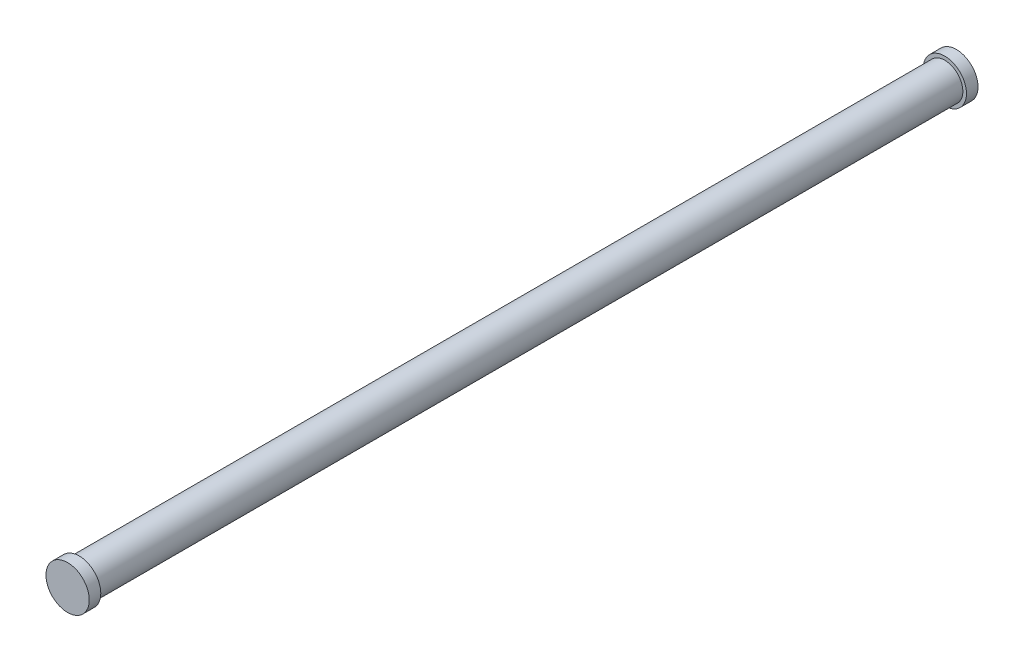
ISO-10303-21;
HEADER;
FILE_DESCRIPTION(('STEP AP214'),'2;1');
FILE_NAME('part.step','',(''),(''),'','','');
FILE_SCHEMA(('AUTOMOTIVE_DESIGN { 1 0 10303 214 1 1 1 1 }'));
ENDSEC;
DATA;
#1=APPLICATION_CONTEXT('core data for automotive mechanical design processes');
#2=APPLICATION_PROTOCOL_DEFINITION('international standard','automotive_design',2000,#1);
#3=PRODUCT_CONTEXT('',#1,'mechanical');
#4=PRODUCT('Part','Part','',(#3));
#5=PRODUCT_RELATED_PRODUCT_CATEGORY('part','',(#4));
#6=PRODUCT_DEFINITION_FORMATION('','',#4);
#7=PRODUCT_DEFINITION_CONTEXT('part definition',#1,'design');
#8=PRODUCT_DEFINITION('design','',#6,#7);
#9=PRODUCT_DEFINITION_SHAPE('','',#8);
#10=(LENGTH_UNIT() NAMED_UNIT(*) SI_UNIT(.MILLI.,.METRE.));
#11=(NAMED_UNIT(*) PLANE_ANGLE_UNIT() SI_UNIT($,.RADIAN.));
#12=(NAMED_UNIT(*) SI_UNIT($,.STERADIAN.) SOLID_ANGLE_UNIT());
#13=UNCERTAINTY_MEASURE_WITH_UNIT(LENGTH_MEASURE(1.E-05),#10,'distance_accuracy_value','');
#14=(GEOMETRIC_REPRESENTATION_CONTEXT(3) GLOBAL_UNCERTAINTY_ASSIGNED_CONTEXT((#13)) GLOBAL_UNIT_ASSIGNED_CONTEXT((#10,
#11,#12)) REPRESENTATION_CONTEXT('',''));
#15=CARTESIAN_POINT('',(0.,0.,0.));
#16=DIRECTION('',(0.,0.,1.));
#17=DIRECTION('',(1.,0.,0.));
#18=AXIS2_PLACEMENT_3D('',#15,#16,#17);
#19=CARTESIAN_POINT('',(0.,0.,-600.));
#20=DIRECTION('',(0.,0.,1.));
#21=DIRECTION('',(1.,0.,0.));
#22=AXIS2_PLACEMENT_3D('',#19,#20,#21);
#23=CYLINDRICAL_SURFACE('',#22,12.5);
#24=CARTESIAN_POINT('',(0.,0.,-600.));
#25=DIRECTION('',(0.,0.,-1.));
#26=DIRECTION('',(-1.,0.,0.));
#27=AXIS2_PLACEMENT_3D('',#24,#25,#26);
#28=CIRCLE('',#27,12.5);
#29=CARTESIAN_POINT('',(-12.5,0.,-600.));
#30=VERTEX_POINT('',#29);
#31=EDGE_CURVE('E50',#30,#30,#28,.F.);
#32=ORIENTED_EDGE('',*,*,#31,.T.);
#33=EDGE_LOOP('',(#32));
#34=FACE_BOUND('',#33,.T.);
#35=CARTESIAN_POINT('',(0.,0.,0.));
#36=DIRECTION('',(0.,0.,1.));
#37=DIRECTION('',(1.,0.,0.));
#38=AXIS2_PLACEMENT_3D('',#35,#36,#37);
#39=CIRCLE('',#38,12.5);
#40=CARTESIAN_POINT('',(12.5,0.,0.));
#41=VERTEX_POINT('',#40);
#42=EDGE_CURVE('E10',#41,#41,#39,.T.);
#43=ORIENTED_EDGE('',*,*,#42,.F.);
#44=EDGE_LOOP('',(#43));
#45=FACE_BOUND('',#44,.T.);
#46=ADVANCED_FACE('F35',(#34,#45),#23,.T.);
#47=CARTESIAN_POINT('',(0.,0.,8.));
#48=DIRECTION('',(0.,0.,-1.));
#49=DIRECTION('',(-1.,0.,0.));
#50=AXIS2_PLACEMENT_3D('',#47,#48,#49);
#51=CYLINDRICAL_SURFACE('',#50,15.);
#52=CARTESIAN_POINT('',(0.,0.,8.));
#53=DIRECTION('',(0.,0.,1.));
#54=DIRECTION('',(1.,0.,0.));
#55=AXIS2_PLACEMENT_3D('',#52,#53,#54);
#56=CIRCLE('',#55,15.);
#57=CARTESIAN_POINT('',(15.,0.,8.));
#58=VERTEX_POINT('',#57);
#59=EDGE_CURVE('E41',#58,#58,#56,.T.);
#60=ORIENTED_EDGE('',*,*,#59,.F.);
#61=EDGE_LOOP('',(#60));
#62=FACE_BOUND('',#61,.T.);
#63=CARTESIAN_POINT('',(0.,0.,0.));
#64=DIRECTION('',(0.,0.,1.));
#65=DIRECTION('',(1.,0.,0.));
#66=AXIS2_PLACEMENT_3D('',#63,#64,#65);
#67=CIRCLE('',#66,15.);
#68=CARTESIAN_POINT('',(15.,0.,0.));
#69=VERTEX_POINT('',#68);
#70=EDGE_CURVE('E45',#69,#69,#67,.T.);
#71=ORIENTED_EDGE('',*,*,#70,.T.);
#72=EDGE_LOOP('',(#71));
#73=FACE_BOUND('',#72,.T.);
#74=ADVANCED_FACE('F77',(#62,#73),#51,.T.);
#75=CARTESIAN_POINT('',(0.,0.,8.));
#76=DIRECTION('',(0.,0.,1.));
#77=DIRECTION('',(1.,0.,0.));
#78=AXIS2_PLACEMENT_3D('',#75,#76,#77);
#79=PLANE('',#78);
#80=ORIENTED_EDGE('',*,*,#59,.T.);
#81=EDGE_LOOP('',(#80));
#82=FACE_BOUND('',#81,.T.);
#83=ADVANCED_FACE('F82',(#82),#79,.T.);
#84=CARTESIAN_POINT('',(0.,0.,0.));
#85=DIRECTION('',(0.,0.,1.));
#86=DIRECTION('',(1.,0.,0.));
#87=AXIS2_PLACEMENT_3D('',#84,#85,#86);
#88=PLANE('',#87);
#89=ORIENTED_EDGE('',*,*,#42,.T.);
#90=EDGE_LOOP('',(#89));
#91=FACE_BOUND('',#90,.T.);
#92=ORIENTED_EDGE('',*,*,#70,.F.);
#93=EDGE_LOOP('',(#92));
#94=FACE_BOUND('',#93,.T.);
#95=ADVANCED_FACE('F74',(#91,#94),#88,.F.);
#96=CARTESIAN_POINT('',(0.,0.,-608.));
#97=DIRECTION('',(0.,0.,1.));
#98=DIRECTION('',(1.,0.,0.));
#99=AXIS2_PLACEMENT_3D('',#96,#97,#98);
#100=CYLINDRICAL_SURFACE('',#99,15.);
#101=CARTESIAN_POINT('',(0.,0.,-608.));
#102=DIRECTION('',(0.,0.,1.));
#103=DIRECTION('',(1.,0.,0.));
#104=AXIS2_PLACEMENT_3D('',#101,#102,#103);
#105=CIRCLE('',#104,15.);
#106=CARTESIAN_POINT('',(15.,0.,-608.));
#107=VERTEX_POINT('',#106);
#108=EDGE_CURVE('E54',#107,#107,#105,.T.);
#109=ORIENTED_EDGE('',*,*,#108,.T.);
#110=EDGE_LOOP('',(#109));
#111=FACE_BOUND('',#110,.T.);
#112=CARTESIAN_POINT('',(0.,0.,-600.));
#113=DIRECTION('',(0.,0.,1.));
#114=DIRECTION('',(1.,0.,0.));
#115=AXIS2_PLACEMENT_3D('',#112,#113,#114);
#116=CIRCLE('',#115,15.);
#117=CARTESIAN_POINT('',(15.,0.,-600.));
#118=VERTEX_POINT('',#117);
#119=EDGE_CURVE('E55',#118,#118,#116,.T.);
#120=ORIENTED_EDGE('',*,*,#119,.F.);
#121=EDGE_LOOP('',(#120));
#122=FACE_BOUND('',#121,.T.);
#123=ADVANCED_FACE('F61',(#111,#122),#100,.T.);
#124=CARTESIAN_POINT('',(0.,0.,-608.));
#125=DIRECTION('',(0.,0.,-1.));
#126=DIRECTION('',(1.,0.,0.));
#127=AXIS2_PLACEMENT_3D('',#124,#125,#126);
#128=PLANE('',#127);
#129=ORIENTED_EDGE('',*,*,#108,.F.);
#130=EDGE_LOOP('',(#129));
#131=FACE_BOUND('',#130,.T.);
#132=ADVANCED_FACE('F64',(#131),#128,.T.);
#133=CARTESIAN_POINT('',(0.,0.,-600.));
#134=DIRECTION('',(0.,0.,-1.));
#135=DIRECTION('',(1.,0.,0.));
#136=AXIS2_PLACEMENT_3D('',#133,#134,#135);
#137=PLANE('',#136);
#138=ORIENTED_EDGE('',*,*,#31,.F.);
#139=EDGE_LOOP('',(#138));
#140=FACE_BOUND('',#139,.T.);
#141=ORIENTED_EDGE('',*,*,#119,.T.);
#142=EDGE_LOOP('',(#141));
#143=FACE_BOUND('',#142,.T.);
#144=ADVANCED_FACE('F66',(#140,#143),#137,.F.);
#145=CLOSED_SHELL('',(#46,#74,#83,#95,#123,#132,#144));
#146=MANIFOLD_SOLID_BREP('B2',#145);
#147=ADVANCED_BREP_SHAPE_REPRESENTATION('',(#18,#146),#14);
#148=SHAPE_DEFINITION_REPRESENTATION(#9,#147);
ENDSEC;
END-ISO-10303-21;
